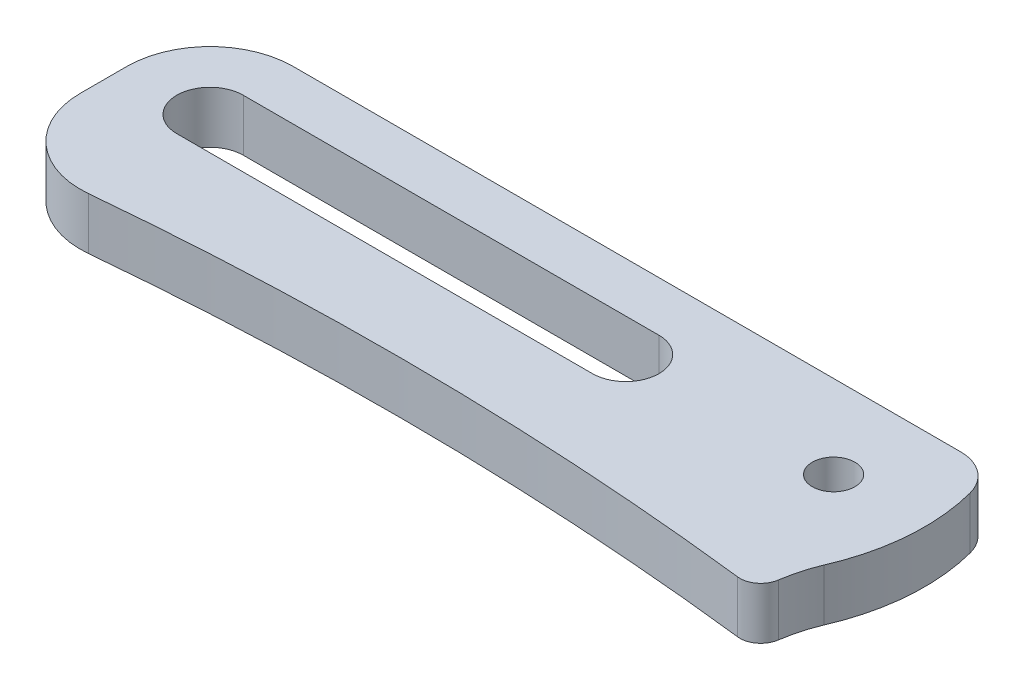
ISO-10303-21;
HEADER;
FILE_DESCRIPTION(('STEP AP214'),'2;1');
FILE_NAME('part.step','',(''),(''),'','','');
FILE_SCHEMA(('AUTOMOTIVE_DESIGN { 1 0 10303 214 1 1 1 1 }'));
ENDSEC;
DATA;
#1=APPLICATION_CONTEXT('core data for automotive mechanical design processes');
#2=APPLICATION_PROTOCOL_DEFINITION('international standard','automotive_design',2000,#1);
#3=PRODUCT_CONTEXT('',#1,'mechanical');
#4=PRODUCT('Part','Part','',(#3));
#5=PRODUCT_RELATED_PRODUCT_CATEGORY('part','',(#4));
#6=PRODUCT_DEFINITION_FORMATION('','',#4);
#7=PRODUCT_DEFINITION_CONTEXT('part definition',#1,'design');
#8=PRODUCT_DEFINITION('design','',#6,#7);
#9=PRODUCT_DEFINITION_SHAPE('','',#8);
#10=(LENGTH_UNIT() NAMED_UNIT(*) SI_UNIT(.MILLI.,.METRE.));
#11=(NAMED_UNIT(*) PLANE_ANGLE_UNIT() SI_UNIT($,.RADIAN.));
#12=(NAMED_UNIT(*) SI_UNIT($,.STERADIAN.) SOLID_ANGLE_UNIT());
#13=UNCERTAINTY_MEASURE_WITH_UNIT(LENGTH_MEASURE(1.E-05),#10,'distance_accuracy_value','');
#14=(GEOMETRIC_REPRESENTATION_CONTEXT(3) GLOBAL_UNCERTAINTY_ASSIGNED_CONTEXT((#13)) GLOBAL_UNIT_ASSIGNED_CONTEXT((#10,
#11,#12)) REPRESENTATION_CONTEXT('',''));
#15=CARTESIAN_POINT('',(0.,0.,0.));
#16=DIRECTION('',(0.,0.,1.));
#17=DIRECTION('',(1.,0.,0.));
#18=AXIS2_PLACEMENT_3D('',#15,#16,#17);
#19=CARTESIAN_POINT('',(0.,2.5,0.));
#20=DIRECTION('',(0.,1.,0.));
#21=DIRECTION('',(0.,0.,1.));
#22=AXIS2_PLACEMENT_3D('',#19,#20,#21);
#23=PLANE('',#22);
#24=CARTESIAN_POINT('',(30.,2.5,0.));
#25=DIRECTION('',(0.,1.,0.));
#26=DIRECTION('',(0.,0.,1.));
#27=AXIS2_PLACEMENT_3D('',#24,#25,#26);
#28=CIRCLE('',#27,1.025);
#29=CARTESIAN_POINT('',(30.,2.5,1.025));
#30=VERTEX_POINT('',#29);
#31=EDGE_CURVE('E176',#30,#30,#28,.T.);
#32=ORIENTED_EDGE('',*,*,#31,.F.);
#33=EDGE_LOOP('',(#32));
#34=FACE_BOUND('',#33,.T.);
#35=DIRECTION('',(1.,0.,0.));
#36=VECTOR('',#35,1.);
#37=CARTESIAN_POINT('',(0.,2.5,1.6));
#38=LINE('',#37,#36);
#39=CARTESIAN_POINT('',(0.,2.5,1.6));
#40=VERTEX_POINT('',#39);
#41=CARTESIAN_POINT('',(20.,2.5,1.6));
#42=VERTEX_POINT('',#41);
#43=EDGE_CURVE('E184',#40,#42,#38,.T.);
#44=ORIENTED_EDGE('',*,*,#43,.F.);
#45=CARTESIAN_POINT('',(0.,2.5,0.));
#46=DIRECTION('',(0.,1.,0.));
#47=DIRECTION('',(0.,0.,1.));
#48=AXIS2_PLACEMENT_3D('',#45,#46,#47);
#49=CIRCLE('',#48,1.6);
#50=CARTESIAN_POINT('',(0.,2.5,-1.6));
#51=VERTEX_POINT('',#50);
#52=EDGE_CURVE('E182',#51,#40,#49,.T.);
#53=ORIENTED_EDGE('',*,*,#52,.F.);
#54=DIRECTION('',(-1.,0.,0.));
#55=VECTOR('',#54,1.);
#56=CARTESIAN_POINT('',(0.,2.5,-1.6));
#57=LINE('',#56,#55);
#58=CARTESIAN_POINT('',(20.,2.5,-1.6));
#59=VERTEX_POINT('',#58);
#60=EDGE_CURVE('E190',#59,#51,#57,.T.);
#61=ORIENTED_EDGE('',*,*,#60,.F.);
#62=CARTESIAN_POINT('',(20.,2.5,0.));
#63=DIRECTION('',(0.,1.,0.));
#64=DIRECTION('',(0.,0.,1.));
#65=AXIS2_PLACEMENT_3D('',#62,#63,#64);
#66=CIRCLE('',#65,1.6);
#67=EDGE_CURVE('E187',#42,#59,#66,.T.);
#68=ORIENTED_EDGE('',*,*,#67,.F.);
#69=EDGE_LOOP('',(#44,#53,#61,#68));
#70=FACE_BOUND('',#69,.T.);
#71=CARTESIAN_POINT('',(24.3765206531013,2.5,0.));
#72=DIRECTION('',(0.,1.,0.));
#73=DIRECTION('',(0.,0.,1.));
#74=AXIS2_PLACEMENT_3D('',#71,#72,#73);
#75=CIRCLE('',#74,10.);
#76=CARTESIAN_POINT('',(33.541672043013,2.5,4.));
#77=VERTEX_POINT('',#76);
#78=CARTESIAN_POINT('',(34.0589790186199,2.5,-2.5));
#79=VERTEX_POINT('',#78);
#80=EDGE_CURVE('E153',#77,#79,#75,.T.);
#81=ORIENTED_EDGE('',*,*,#80,.T.);
#82=CARTESIAN_POINT('',(32.1224873455161,2.5,-2.));
#83=DIRECTION('',(0.,1.,0.));
#84=DIRECTION('',(0.,0.,1.));
#85=AXIS2_PLACEMENT_3D('',#82,#83,#84);
#86=CIRCLE('',#85,2.);
#87=CARTESIAN_POINT('',(32.1224873455161,2.5,-4.));
#88=VERTEX_POINT('',#87);
#89=EDGE_CURVE('E62',#79,#88,#86,.T.);
#90=ORIENTED_EDGE('',*,*,#89,.T.);
#91=DIRECTION('',(-1.,0.,0.));
#92=VECTOR('',#91,1.);
#93=CARTESIAN_POINT('',(0.,2.5,-4.));
#94=LINE('',#93,#92);
#95=CARTESIAN_POINT('',(0.,2.5,-4.));
#96=VERTEX_POINT('',#95);
#97=EDGE_CURVE('E216',#88,#96,#94,.T.);
#98=ORIENTED_EDGE('',*,*,#97,.T.);
#99=CARTESIAN_POINT('',(0.,2.5,0.));
#100=DIRECTION('',(0.,1.,0.));
#101=DIRECTION('',(0.,0.,1.));
#102=AXIS2_PLACEMENT_3D('',#99,#100,#101);
#103=CIRCLE('',#102,4.);
#104=CARTESIAN_POINT('',(-4.,2.5,0.));
#105=VERTEX_POINT('',#104);
#106=EDGE_CURVE('E213',#96,#105,#103,.T.);
#107=ORIENTED_EDGE('',*,*,#106,.T.);
#108=DIRECTION('',(0.,0.,1.));
#109=VECTOR('',#108,1.);
#110=CARTESIAN_POINT('',(-4.,2.5,0.));
#111=LINE('',#110,#109);
#112=CARTESIAN_POINT('',(-4.,2.5,2.23894456591414));
#113=VERTEX_POINT('',#112);
#114=EDGE_CURVE('E167',#105,#113,#111,.T.);
#115=ORIENTED_EDGE('',*,*,#114,.T.);
#116=CARTESIAN_POINT('',(0.,2.5,2.23894456591414));
#117=DIRECTION('',(0.,1.,0.));
#118=DIRECTION('',(0.,0.,1.));
#119=AXIS2_PLACEMENT_3D('',#116,#117,#118);
#120=CIRCLE('',#119,4.);
#121=CARTESIAN_POINT('',(0.376623376623376,2.5,6.22117444779952));
#122=VERTEX_POINT('',#121);
#123=EDGE_CURVE('E231',#113,#122,#120,.T.);
#124=ORIENTED_EDGE('',*,*,#123,.T.);
#125=CARTESIAN_POINT('',(14.5,2.5,155.554795018501));
#126=DIRECTION('',(0.,-1.,0.));
#127=DIRECTION('',(0.,0.,-1.));
#128=AXIS2_PLACEMENT_3D('',#125,#126,#127);
#129=CIRCLE('',#128,150.);
#130=CARTESIAN_POINT('',(31.962163662166,2.5,6.57468614407541));
#131=VERTEX_POINT('',#130);
#132=EDGE_CURVE('E143',#122,#131,#129,.T.);
#133=ORIENTED_EDGE('',*,*,#132,.T.);
#134=CARTESIAN_POINT('',(32.0785780865804,2.5,5.58148541824591));
#135=DIRECTION('',(0.,1.,0.));
#136=DIRECTION('',(0.,0.,1.));
#137=AXIS2_PLACEMENT_3D('',#134,#135,#136);
#138=CIRCLE('',#137,1.);
#139=CARTESIAN_POINT('',(33.0687558257579,2.5,5.72129974096517));
#140=VERTEX_POINT('',#139);
#141=EDGE_CURVE('E238',#131,#140,#138,.T.);
#142=ORIENTED_EDGE('',*,*,#141,.T.);
#143=CARTESIAN_POINT('',(40.,2.5,6.7));
#144=DIRECTION('',(0.,-1.,0.));
#145=DIRECTION('',(0.,0.,-1.));
#146=AXIS2_PLACEMENT_3D('',#143,#144,#145);
#147=CIRCLE('',#146,7.);
#148=EDGE_CURVE('E170',#140,#77,#147,.T.);
#149=ORIENTED_EDGE('',*,*,#148,.T.);
#150=EDGE_LOOP('',(#81,#90,#98,#107,#115,#124,#133,#142,#149));
#151=FACE_BOUND('',#150,.T.);
#152=ADVANCED_FACE('F40',(#34,#70,#151),#23,.T.);
#153=CARTESIAN_POINT('',(0.,0.,0.));
#154=DIRECTION('',(0.,1.,0.));
#155=DIRECTION('',(0.,0.,1.));
#156=AXIS2_PLACEMENT_3D('',#153,#154,#155);
#157=PLANE('',#156);
#158=CARTESIAN_POINT('',(0.,0.,0.));
#159=DIRECTION('',(0.,1.,0.));
#160=DIRECTION('',(0.,0.,1.));
#161=AXIS2_PLACEMENT_3D('',#158,#159,#160);
#162=CIRCLE('',#161,1.6);
#163=CARTESIAN_POINT('',(0.,0.,-1.6));
#164=VERTEX_POINT('',#163);
#165=CARTESIAN_POINT('',(0.,0.,1.6));
#166=VERTEX_POINT('',#165);
#167=EDGE_CURVE('E179',#164,#166,#162,.T.);
#168=ORIENTED_EDGE('',*,*,#167,.T.);
#169=DIRECTION('',(1.,0.,0.));
#170=VECTOR('',#169,1.);
#171=CARTESIAN_POINT('',(0.,0.,1.6));
#172=LINE('',#171,#170);
#173=CARTESIAN_POINT('',(20.,0.,1.6));
#174=VERTEX_POINT('',#173);
#175=EDGE_CURVE('E195',#166,#174,#172,.T.);
#176=ORIENTED_EDGE('',*,*,#175,.T.);
#177=CARTESIAN_POINT('',(20.,0.,0.));
#178=DIRECTION('',(0.,1.,0.));
#179=DIRECTION('',(0.,0.,1.));
#180=AXIS2_PLACEMENT_3D('',#177,#178,#179);
#181=CIRCLE('',#180,1.6);
#182=CARTESIAN_POINT('',(20.,0.,-1.6));
#183=VERTEX_POINT('',#182);
#184=EDGE_CURVE('E198',#174,#183,#181,.T.);
#185=ORIENTED_EDGE('',*,*,#184,.T.);
#186=DIRECTION('',(-1.,0.,0.));
#187=VECTOR('',#186,1.);
#188=CARTESIAN_POINT('',(0.,0.,-1.6));
#189=LINE('',#188,#187);
#190=EDGE_CURVE('E185',#183,#164,#189,.T.);
#191=ORIENTED_EDGE('',*,*,#190,.T.);
#192=EDGE_LOOP('',(#168,#176,#185,#191));
#193=FACE_BOUND('',#192,.T.);
#194=CARTESIAN_POINT('',(30.,0.,0.));
#195=DIRECTION('',(0.,1.,0.));
#196=DIRECTION('',(0.,0.,1.));
#197=AXIS2_PLACEMENT_3D('',#194,#195,#196);
#198=CIRCLE('',#197,1.025);
#199=CARTESIAN_POINT('',(30.,0.,1.025));
#200=VERTEX_POINT('',#199);
#201=EDGE_CURVE('E154',#200,#200,#198,.T.);
#202=ORIENTED_EDGE('',*,*,#201,.T.);
#203=EDGE_LOOP('',(#202));
#204=FACE_BOUND('',#203,.T.);
#205=DIRECTION('',(-1.,0.,0.));
#206=VECTOR('',#205,1.);
#207=CARTESIAN_POINT('',(0.,0.,-4.));
#208=LINE('',#207,#206);
#209=CARTESIAN_POINT('',(32.1224873455161,0.,-4.));
#210=VERTEX_POINT('',#209);
#211=CARTESIAN_POINT('',(0.,0.,-4.));
#212=VERTEX_POINT('',#211);
#213=EDGE_CURVE('E217',#210,#212,#208,.T.);
#214=ORIENTED_EDGE('',*,*,#213,.F.);
#215=CARTESIAN_POINT('',(32.1224873455161,0.,-2.));
#216=DIRECTION('',(0.,1.,0.));
#217=DIRECTION('',(0.,0.,1.));
#218=AXIS2_PLACEMENT_3D('',#215,#216,#217);
#219=CIRCLE('',#218,2.);
#220=CARTESIAN_POINT('',(34.0589790186199,0.,-2.5));
#221=VERTEX_POINT('',#220);
#222=EDGE_CURVE('E11',#210,#221,#219,.F.);
#223=ORIENTED_EDGE('',*,*,#222,.T.);
#224=CARTESIAN_POINT('',(24.3765206531013,0.,0.));
#225=DIRECTION('',(0.,1.,0.));
#226=DIRECTION('',(0.,0.,1.));
#227=AXIS2_PLACEMENT_3D('',#224,#225,#226);
#228=CIRCLE('',#227,10.);
#229=CARTESIAN_POINT('',(33.541672043013,0.,4.));
#230=VERTEX_POINT('',#229);
#231=EDGE_CURVE('E151',#230,#221,#228,.T.);
#232=ORIENTED_EDGE('',*,*,#231,.F.);
#233=CARTESIAN_POINT('',(40.,0.,6.7));
#234=DIRECTION('',(0.,-1.,0.));
#235=DIRECTION('',(0.,0.,-1.));
#236=AXIS2_PLACEMENT_3D('',#233,#234,#235);
#237=CIRCLE('',#236,7.);
#238=CARTESIAN_POINT('',(33.0687558257579,0.,5.72129974096517));
#239=VERTEX_POINT('',#238);
#240=EDGE_CURVE('E134',#239,#230,#237,.T.);
#241=ORIENTED_EDGE('',*,*,#240,.F.);
#242=CARTESIAN_POINT('',(32.0785780865804,0.,5.58148541824591));
#243=DIRECTION('',(0.,1.,0.));
#244=DIRECTION('',(0.,0.,1.));
#245=AXIS2_PLACEMENT_3D('',#242,#243,#244);
#246=CIRCLE('',#245,1.);
#247=CARTESIAN_POINT('',(31.962163662166,0.,6.57468614407541));
#248=VERTEX_POINT('',#247);
#249=EDGE_CURVE('E234',#239,#248,#246,.F.);
#250=ORIENTED_EDGE('',*,*,#249,.T.);
#251=CARTESIAN_POINT('',(14.5,0.,155.554795018501));
#252=DIRECTION('',(0.,-1.,0.));
#253=DIRECTION('',(0.,0.,-1.));
#254=AXIS2_PLACEMENT_3D('',#251,#252,#253);
#255=CIRCLE('',#254,150.);
#256=CARTESIAN_POINT('',(0.376623376623376,0.,6.22117444779952));
#257=VERTEX_POINT('',#256);
#258=EDGE_CURVE('E159',#257,#248,#255,.T.);
#259=ORIENTED_EDGE('',*,*,#258,.F.);
#260=CARTESIAN_POINT('',(0.,0.,2.23894456591414));
#261=DIRECTION('',(0.,1.,0.));
#262=DIRECTION('',(0.,0.,1.));
#263=AXIS2_PLACEMENT_3D('',#260,#261,#262);
#264=CIRCLE('',#263,4.);
#265=CARTESIAN_POINT('',(-4.,0.,2.23894456591414));
#266=VERTEX_POINT('',#265);
#267=EDGE_CURVE('E227',#257,#266,#264,.F.);
#268=ORIENTED_EDGE('',*,*,#267,.T.);
#269=DIRECTION('',(0.,0.,1.));
#270=VECTOR('',#269,1.);
#271=CARTESIAN_POINT('',(-4.,0.,0.));
#272=LINE('',#271,#270);
#273=CARTESIAN_POINT('',(-4.,0.,0.));
#274=VERTEX_POINT('',#273);
#275=EDGE_CURVE('E144',#274,#266,#272,.T.);
#276=ORIENTED_EDGE('',*,*,#275,.F.);
#277=CARTESIAN_POINT('',(0.,0.,0.));
#278=DIRECTION('',(0.,1.,0.));
#279=DIRECTION('',(0.,0.,1.));
#280=AXIS2_PLACEMENT_3D('',#277,#278,#279);
#281=CIRCLE('',#280,4.);
#282=EDGE_CURVE('E212',#212,#274,#281,.T.);
#283=ORIENTED_EDGE('',*,*,#282,.F.);
#284=EDGE_LOOP('',(#214,#223,#232,#241,#250,#259,#268,#276,#283));
#285=FACE_BOUND('',#284,.T.);
#286=ADVANCED_FACE('F157',(#193,#204,#285),#157,.F.);
#287=CARTESIAN_POINT('',(0.,2.5,-4.));
#288=DIRECTION('',(0.,0.,1.));
#289=DIRECTION('',(1.,0.,0.));
#290=AXIS2_PLACEMENT_3D('',#287,#288,#289);
#291=PLANE('',#290);
#292=ORIENTED_EDGE('',*,*,#97,.F.);
#293=DIRECTION('',(0.,-1.,0.));
#294=VECTOR('',#293,1.);
#295=CARTESIAN_POINT('',(32.1224873455161,0.,-4.));
#296=LINE('',#295,#294);
#297=EDGE_CURVE('E48',#88,#210,#296,.T.);
#298=ORIENTED_EDGE('',*,*,#297,.T.);
#299=ORIENTED_EDGE('',*,*,#213,.T.);
#300=DIRECTION('',(0.,-1.,0.));
#301=VECTOR('',#300,1.);
#302=CARTESIAN_POINT('',(0.,2.5,-4.));
#303=LINE('',#302,#301);
#304=EDGE_CURVE('E219',#96,#212,#303,.T.);
#305=ORIENTED_EDGE('',*,*,#304,.F.);
#306=EDGE_LOOP('',(#292,#298,#299,#305));
#307=FACE_BOUND('',#306,.T.);
#308=ADVANCED_FACE('F265',(#307),#291,.F.);
#309=CARTESIAN_POINT('',(0.,2.5,0.));
#310=DIRECTION('',(0.,-1.,0.));
#311=DIRECTION('',(0.,0.,-1.));
#312=AXIS2_PLACEMENT_3D('',#309,#310,#311);
#313=CYLINDRICAL_SURFACE('',#312,4.);
#314=DIRECTION('',(0.,-1.,0.));
#315=VECTOR('',#314,1.);
#316=CARTESIAN_POINT('',(-4.,2.5,0.));
#317=LINE('',#316,#315);
#318=EDGE_CURVE('E155',#105,#274,#317,.T.);
#319=ORIENTED_EDGE('',*,*,#318,.F.);
#320=ORIENTED_EDGE('',*,*,#106,.F.);
#321=ORIENTED_EDGE('',*,*,#304,.T.);
#322=ORIENTED_EDGE('',*,*,#282,.T.);
#323=EDGE_LOOP('',(#319,#320,#321,#322));
#324=FACE_BOUND('',#323,.T.);
#325=ADVANCED_FACE('F263',(#324),#313,.T.);
#326=CARTESIAN_POINT('',(0.,2.5,0.));
#327=DIRECTION('',(0.,-1.,0.));
#328=DIRECTION('',(0.,0.,-1.));
#329=AXIS2_PLACEMENT_3D('',#326,#327,#328);
#330=CYLINDRICAL_SURFACE('',#329,1.6);
#331=ORIENTED_EDGE('',*,*,#167,.F.);
#332=DIRECTION('',(0.,-1.,0.));
#333=VECTOR('',#332,1.);
#334=CARTESIAN_POINT('',(0.,2.5,-1.6));
#335=LINE('',#334,#333);
#336=EDGE_CURVE('E192',#51,#164,#335,.T.);
#337=ORIENTED_EDGE('',*,*,#336,.F.);
#338=ORIENTED_EDGE('',*,*,#52,.T.);
#339=DIRECTION('',(0.,-1.,0.));
#340=VECTOR('',#339,1.);
#341=CARTESIAN_POINT('',(0.,2.5,1.6));
#342=LINE('',#341,#340);
#343=EDGE_CURVE('E209',#40,#166,#342,.T.);
#344=ORIENTED_EDGE('',*,*,#343,.T.);
#345=EDGE_LOOP('',(#331,#337,#338,#344));
#346=FACE_BOUND('',#345,.T.);
#347=ADVANCED_FACE('F281',(#346),#330,.F.);
#348=CARTESIAN_POINT('',(0.,2.5,1.6));
#349=DIRECTION('',(0.,0.,-1.));
#350=DIRECTION('',(-1.,0.,0.));
#351=AXIS2_PLACEMENT_3D('',#348,#349,#350);
#352=PLANE('',#351);
#353=ORIENTED_EDGE('',*,*,#175,.F.);
#354=ORIENTED_EDGE('',*,*,#343,.F.);
#355=ORIENTED_EDGE('',*,*,#43,.T.);
#356=DIRECTION('',(0.,-1.,0.));
#357=VECTOR('',#356,1.);
#358=CARTESIAN_POINT('',(20.,2.5,1.6));
#359=LINE('',#358,#357);
#360=EDGE_CURVE('E207',#42,#174,#359,.T.);
#361=ORIENTED_EDGE('',*,*,#360,.T.);
#362=EDGE_LOOP('',(#353,#354,#355,#361));
#363=FACE_BOUND('',#362,.T.);
#364=ADVANCED_FACE('F312',(#363),#352,.T.);
#365=CARTESIAN_POINT('',(20.,2.5,0.));
#366=DIRECTION('',(0.,-1.,0.));
#367=DIRECTION('',(0.,0.,-1.));
#368=AXIS2_PLACEMENT_3D('',#365,#366,#367);
#369=CYLINDRICAL_SURFACE('',#368,1.6);
#370=ORIENTED_EDGE('',*,*,#184,.F.);
#371=ORIENTED_EDGE('',*,*,#360,.F.);
#372=ORIENTED_EDGE('',*,*,#67,.T.);
#373=DIRECTION('',(0.,-1.,0.));
#374=VECTOR('',#373,1.);
#375=CARTESIAN_POINT('',(20.,2.5,-1.6));
#376=LINE('',#375,#374);
#377=EDGE_CURVE('E205',#59,#183,#376,.T.);
#378=ORIENTED_EDGE('',*,*,#377,.T.);
#379=EDGE_LOOP('',(#370,#371,#372,#378));
#380=FACE_BOUND('',#379,.T.);
#381=ADVANCED_FACE('F309',(#380),#369,.F.);
#382=CARTESIAN_POINT('',(0.,2.5,-1.6));
#383=DIRECTION('',(0.,0.,1.));
#384=DIRECTION('',(1.,0.,0.));
#385=AXIS2_PLACEMENT_3D('',#382,#383,#384);
#386=PLANE('',#385);
#387=ORIENTED_EDGE('',*,*,#190,.F.);
#388=ORIENTED_EDGE('',*,*,#377,.F.);
#389=ORIENTED_EDGE('',*,*,#60,.T.);
#390=ORIENTED_EDGE('',*,*,#336,.T.);
#391=EDGE_LOOP('',(#387,#388,#389,#390));
#392=FACE_BOUND('',#391,.T.);
#393=ADVANCED_FACE('F305',(#392),#386,.T.);
#394=CARTESIAN_POINT('',(30.,2.5,0.));
#395=DIRECTION('',(0.,-1.,0.));
#396=DIRECTION('',(0.,0.,-1.));
#397=AXIS2_PLACEMENT_3D('',#394,#395,#396);
#398=CYLINDRICAL_SURFACE('',#397,1.025);
#399=ORIENTED_EDGE('',*,*,#201,.F.);
#400=EDGE_LOOP('',(#399));
#401=FACE_BOUND('',#400,.T.);
#402=ORIENTED_EDGE('',*,*,#31,.T.);
#403=EDGE_LOOP('',(#402));
#404=FACE_BOUND('',#403,.T.);
#405=ADVANCED_FACE('F302',(#401,#404),#398,.F.);
#406=CARTESIAN_POINT('',(14.5,2.5,155.554795018501));
#407=DIRECTION('',(0.,-1.,0.));
#408=DIRECTION('',(0.,0.,-1.));
#409=AXIS2_PLACEMENT_3D('',#406,#407,#408);
#410=CYLINDRICAL_SURFACE('',#409,150.);
#411=ORIENTED_EDGE('',*,*,#258,.T.);
#412=DIRECTION('',(0.,-1.,0.));
#413=VECTOR('',#412,1.);
#414=CARTESIAN_POINT('',(31.962163662166,2.5,6.57468614407541));
#415=LINE('',#414,#413);
#416=EDGE_CURVE('E236',#248,#131,#415,.F.);
#417=ORIENTED_EDGE('',*,*,#416,.T.);
#418=ORIENTED_EDGE('',*,*,#132,.F.);
#419=DIRECTION('',(0.,-1.,0.));
#420=VECTOR('',#419,1.);
#421=CARTESIAN_POINT('',(0.376623376623378,2.5,6.22117444779954));
#422=LINE('',#421,#420);
#423=EDGE_CURVE('E224',#122,#257,#422,.T.);
#424=ORIENTED_EDGE('',*,*,#423,.T.);
#425=EDGE_LOOP('',(#411,#417,#418,#424));
#426=FACE_BOUND('',#425,.T.);
#427=ADVANCED_FACE('F249',(#426),#410,.F.);
#428=CARTESIAN_POINT('',(40.,2.5,6.7));
#429=DIRECTION('',(0.,-1.,0.));
#430=DIRECTION('',(0.,0.,-1.));
#431=AXIS2_PLACEMENT_3D('',#428,#429,#430);
#432=CYLINDRICAL_SURFACE('',#431,7.);
#433=ORIENTED_EDGE('',*,*,#148,.F.);
#434=DIRECTION('',(0.,-1.,0.));
#435=VECTOR('',#434,1.);
#436=CARTESIAN_POINT('',(33.0687558257579,2.5,5.72129974096517));
#437=LINE('',#436,#435);
#438=EDGE_CURVE('E140',#140,#239,#437,.T.);
#439=ORIENTED_EDGE('',*,*,#438,.T.);
#440=ORIENTED_EDGE('',*,*,#240,.T.);
#441=DIRECTION('',(0.,-1.,0.));
#442=VECTOR('',#441,1.);
#443=CARTESIAN_POINT('',(33.541672043013,2.5,4.));
#444=LINE('',#443,#442);
#445=EDGE_CURVE('E138',#77,#230,#444,.T.);
#446=ORIENTED_EDGE('',*,*,#445,.F.);
#447=EDGE_LOOP('',(#433,#439,#440,#446));
#448=FACE_BOUND('',#447,.T.);
#449=ADVANCED_FACE('F137',(#448),#432,.F.);
#450=CARTESIAN_POINT('',(-4.,2.5,0.));
#451=DIRECTION('',(1.,0.,0.));
#452=DIRECTION('',(0.,0.,-1.));
#453=AXIS2_PLACEMENT_3D('',#450,#451,#452);
#454=PLANE('',#453);
#455=ORIENTED_EDGE('',*,*,#275,.T.);
#456=DIRECTION('',(0.,-1.,0.));
#457=VECTOR('',#456,1.);
#458=CARTESIAN_POINT('',(-4.,2.5,2.23894456591414));
#459=LINE('',#458,#457);
#460=EDGE_CURVE('E229',#266,#113,#459,.F.);
#461=ORIENTED_EDGE('',*,*,#460,.T.);
#462=ORIENTED_EDGE('',*,*,#114,.F.);
#463=ORIENTED_EDGE('',*,*,#318,.T.);
#464=EDGE_LOOP('',(#455,#461,#462,#463));
#465=FACE_BOUND('',#464,.T.);
#466=ADVANCED_FACE('F259',(#465),#454,.F.);
#467=CARTESIAN_POINT('',(0.,2.5,2.23894456591414));
#468=DIRECTION('',(0.,-1.,0.));
#469=DIRECTION('',(0.,0.,-1.));
#470=AXIS2_PLACEMENT_3D('',#467,#468,#469);
#471=CYLINDRICAL_SURFACE('',#470,4.);
#472=ORIENTED_EDGE('',*,*,#123,.F.);
#473=ORIENTED_EDGE('',*,*,#460,.F.);
#474=ORIENTED_EDGE('',*,*,#267,.F.);
#475=ORIENTED_EDGE('',*,*,#423,.F.);
#476=EDGE_LOOP('',(#472,#473,#474,#475));
#477=FACE_BOUND('',#476,.T.);
#478=ADVANCED_FACE('F254',(#477),#471,.T.);
#479=CARTESIAN_POINT('',(24.3765206531013,0.,0.));
#480=DIRECTION('',(0.,1.,0.));
#481=DIRECTION('',(0.,0.,1.));
#482=AXIS2_PLACEMENT_3D('',#479,#480,#481);
#483=CYLINDRICAL_SURFACE('',#482,10.);
#484=ORIENTED_EDGE('',*,*,#231,.T.);
#485=DIRECTION('',(0.,1.,0.));
#486=VECTOR('',#485,1.);
#487=CARTESIAN_POINT('',(34.0589790186199,0.,-2.5));
#488=LINE('',#487,#486);
#489=EDGE_CURVE('E240',#221,#79,#488,.T.);
#490=ORIENTED_EDGE('',*,*,#489,.T.);
#491=ORIENTED_EDGE('',*,*,#80,.F.);
#492=ORIENTED_EDGE('',*,*,#445,.T.);
#493=EDGE_LOOP('',(#484,#490,#491,#492));
#494=FACE_BOUND('',#493,.T.);
#495=ADVANCED_FACE('F149',(#494),#483,.T.);
#496=CARTESIAN_POINT('',(32.0785780865804,2.5,5.58148541824591));
#497=DIRECTION('',(0.,-1.,0.));
#498=DIRECTION('',(0.,0.,-1.));
#499=AXIS2_PLACEMENT_3D('',#496,#497,#498);
#500=CYLINDRICAL_SURFACE('',#499,1.);
#501=ORIENTED_EDGE('',*,*,#141,.F.);
#502=ORIENTED_EDGE('',*,*,#416,.F.);
#503=ORIENTED_EDGE('',*,*,#249,.F.);
#504=ORIENTED_EDGE('',*,*,#438,.F.);
#505=EDGE_LOOP('',(#501,#502,#503,#504));
#506=FACE_BOUND('',#505,.T.);
#507=ADVANCED_FACE('F245',(#506),#500,.T.);
#508=CARTESIAN_POINT('',(32.1224873455161,0.,-2.));
#509=DIRECTION('',(0.,1.,0.));
#510=DIRECTION('',(0.,0.,1.));
#511=AXIS2_PLACEMENT_3D('',#508,#509,#510);
#512=CYLINDRICAL_SURFACE('',#511,2.);
#513=ORIENTED_EDGE('',*,*,#222,.F.);
#514=ORIENTED_EDGE('',*,*,#297,.F.);
#515=ORIENTED_EDGE('',*,*,#89,.F.);
#516=ORIENTED_EDGE('',*,*,#489,.F.);
#517=EDGE_LOOP('',(#513,#514,#515,#516));
#518=FACE_BOUND('',#517,.T.);
#519=ADVANCED_FACE('F42',(#518),#512,.T.);
#520=CLOSED_SHELL('',(#152,#286,#308,#325,#347,#364,#381,#393,#405,#427,#449,#466,#478,#495,
#507,#519));
#521=MANIFOLD_SOLID_BREP('B2',#520);
#522=ADVANCED_BREP_SHAPE_REPRESENTATION('',(#18,#521),#14);
#523=SHAPE_DEFINITION_REPRESENTATION(#9,#522);
ENDSEC;
END-ISO-10303-21;
